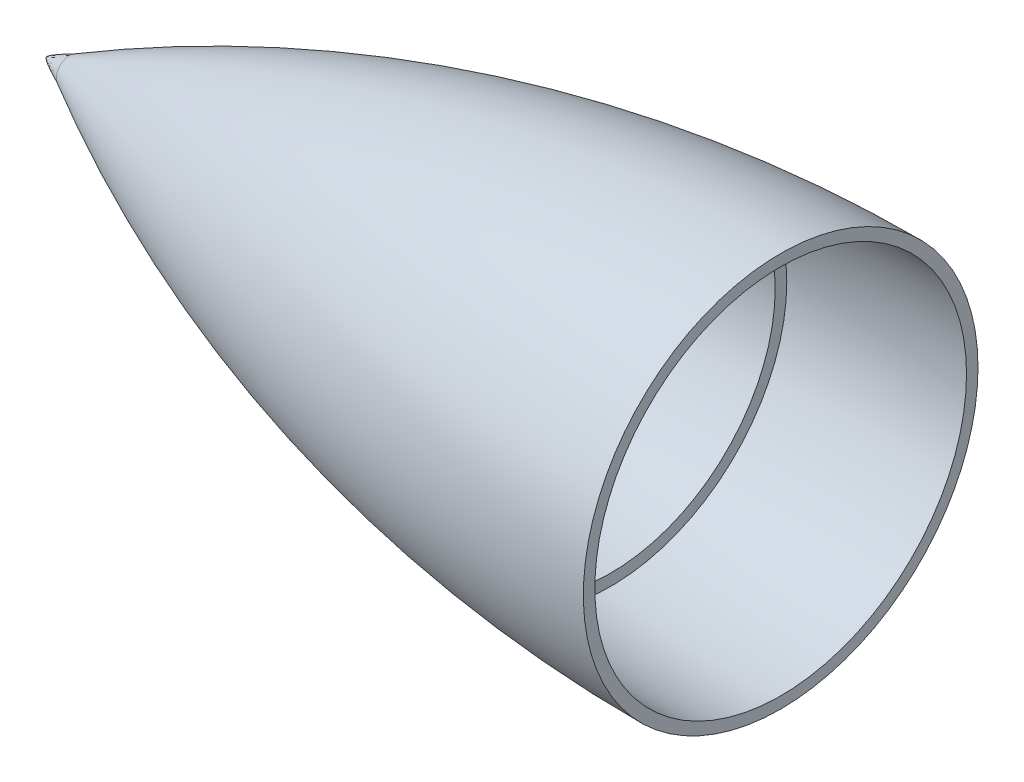
ISO-10303-21;
HEADER;
FILE_DESCRIPTION(('STEP AP214'),'2;1');
FILE_NAME('part.step','',(''),(''),'','','');
FILE_SCHEMA(('AUTOMOTIVE_DESIGN { 1 0 10303 214 1 1 1 1 }'));
ENDSEC;
DATA;
#1=APPLICATION_CONTEXT('core data for automotive mechanical design processes');
#2=APPLICATION_PROTOCOL_DEFINITION('international standard','automotive_design',2000,#1);
#3=PRODUCT_CONTEXT('',#1,'mechanical');
#4=PRODUCT('Part','Part','',(#3));
#5=PRODUCT_RELATED_PRODUCT_CATEGORY('part','',(#4));
#6=PRODUCT_DEFINITION_FORMATION('','',#4);
#7=PRODUCT_DEFINITION_CONTEXT('part definition',#1,'design');
#8=PRODUCT_DEFINITION('design','',#6,#7);
#9=PRODUCT_DEFINITION_SHAPE('','',#8);
#10=(LENGTH_UNIT() NAMED_UNIT(*) SI_UNIT(.MILLI.,.METRE.));
#11=(NAMED_UNIT(*) PLANE_ANGLE_UNIT() SI_UNIT($,.RADIAN.));
#12=(NAMED_UNIT(*) SI_UNIT($,.STERADIAN.) SOLID_ANGLE_UNIT());
#13=UNCERTAINTY_MEASURE_WITH_UNIT(LENGTH_MEASURE(1.E-05),#10,'distance_accuracy_value','');
#14=(GEOMETRIC_REPRESENTATION_CONTEXT(3) GLOBAL_UNCERTAINTY_ASSIGNED_CONTEXT((#13)) GLOBAL_UNIT_ASSIGNED_CONTEXT((#10,
#11,#12)) REPRESENTATION_CONTEXT('',''));
#15=CARTESIAN_POINT('',(0.,0.,0.));
#16=DIRECTION('',(0.,0.,1.));
#17=DIRECTION('',(1.,0.,0.));
#18=AXIS2_PLACEMENT_3D('',#15,#16,#17);
#19=CARTESIAN_POINT('',(0.,276.174418604651,0.));
#20=DIRECTION('',(1.,0.,0.));
#21=DIRECTION('',(0.,0.,-1.));
#22=AXIS2_PLACEMENT_3D('',#19,#20,#21);
#23=DEGENERATE_TOROIDAL_SURFACE('',#22,276.174418604651,319.174418604651,.F.);
#24=CARTESIAN_POINT('',(0.,276.174418604651,0.));
#25=DIRECTION('',(1.,0.,0.));
#26=DIRECTION('',(0.,0.,-1.));
#27=AXIS2_PLACEMENT_3D('',#24,#25,#26);
#28=CIRCLE('',#27,43.);
#29=CARTESIAN_POINT('',(0.,276.174418604651,-43.));
#30=VERTEX_POINT('',#29);
#31=EDGE_CURVE('E47',#30,#30,#28,.T.);
#32=ORIENTED_EDGE('',*,*,#31,.F.);
#33=EDGE_LOOP('',(#32));
#34=FACE_BOUND('',#33,.T.);
#35=CARTESIAN_POINT('',(-155.,276.174418604651,0.));
#36=DIRECTION('',(-1.,0.,0.));
#37=DIRECTION('',(0.,-1.,0.));
#38=AXIS2_PLACEMENT_3D('',#35,#36,#37);
#39=CIRCLE('',#38,2.83688849887309);
#40=CARTESIAN_POINT('',(-155.,273.337530105778,0.));
#41=VERTEX_POINT('',#40);
#42=EDGE_CURVE('E60',#41,#41,#39,.T.);
#43=ORIENTED_EDGE('',*,*,#42,.F.);
#44=EDGE_LOOP('',(#43));
#45=FACE_BOUND('',#44,.T.);
#46=ADVANCED_FACE('F39',(#34,#45),#23,.F.);
#47=CARTESIAN_POINT('',(0.,276.174418604651,0.));
#48=DIRECTION('',(1.,0.,0.));
#49=DIRECTION('',(0.,0.,-1.));
#50=AXIS2_PLACEMENT_3D('',#47,#48,#49);
#51=DEGENERATE_TOROIDAL_SURFACE('',#50,276.174418604651,316.674418604651,.F.);
#52=CARTESIAN_POINT('',(-37.,276.174418604651,0.));
#53=DIRECTION('',(1.,0.,0.));
#54=DIRECTION('',(0.,0.,-1.));
#55=AXIS2_PLACEMENT_3D('',#52,#53,#54);
#56=CIRCLE('',#55,38.3310462104994);
#57=CARTESIAN_POINT('',(-37.,276.174418604651,-38.3310462104994));
#58=VERTEX_POINT('',#57);
#59=EDGE_CURVE('E62',#58,#58,#56,.T.);
#60=ORIENTED_EDGE('',*,*,#59,.F.);
#61=EDGE_LOOP('',(#60));
#62=FACE_BOUND('',#61,.T.);
#63=CARTESIAN_POINT('',(0.,276.174418604651,0.));
#64=DIRECTION('',(1.,0.,0.));
#65=DIRECTION('',(0.,0.,-1.));
#66=AXIS2_PLACEMENT_3D('',#63,#64,#65);
#67=CIRCLE('',#66,40.5000000000001);
#68=CARTESIAN_POINT('',(0.,276.174418604651,-40.5000000000001));
#69=VERTEX_POINT('',#68);
#70=EDGE_CURVE('E11',#69,#69,#67,.T.);
#71=ORIENTED_EDGE('',*,*,#70,.T.);
#72=EDGE_LOOP('',(#71));
#73=FACE_BOUND('',#72,.T.);
#74=ADVANCED_FACE('F41',(#62,#73),#51,.T.);
#75=CARTESIAN_POINT('',(0.,319.174418604651,0.));
#76=DIRECTION('',(-1.,0.,0.));
#77=DIRECTION('',(0.,0.,1.));
#78=AXIS2_PLACEMENT_3D('',#75,#76,#77);
#79=PLANE('',#78);
#80=ORIENTED_EDGE('',*,*,#70,.F.);
#81=EDGE_LOOP('',(#80));
#82=FACE_BOUND('',#81,.T.);
#83=ORIENTED_EDGE('',*,*,#31,.T.);
#84=EDGE_LOOP('',(#83));
#85=FACE_BOUND('',#84,.T.);
#86=ADVANCED_FACE('F76',(#82,#85),#79,.F.);
#87=CARTESIAN_POINT('',(0.,276.174418604651,276.174418604651));
#88=DIRECTION('',(0.,-1.,0.));
#89=DIRECTION('',(0.,0.,-1.));
#90=AXIS2_PLACEMENT_3D('',#87,#88,#89);
#91=CIRCLE('',#90,314.174418604651);
#92=TRIMMED_CURVE('',#91,(PARAMETER_VALUE(-0.496934579399528)),
(PARAMETER_VALUE(0.496934579399528)),.T.,.PARAMETER.);
#93=CARTESIAN_POINT('',(0.,276.174418604651,0.));
#94=DIRECTION('',(1.,0.,0.));
#95=AXIS1_PLACEMENT('',#93,#94);
#96=SURFACE_OF_REVOLUTION('',#92,#95);
#97=CARTESIAN_POINT('',(-149.777354142586,276.174418604651,0.));
#98=VERTEX_POINT('',#97);
#99=VERTEX_LOOP('',#98);
#100=FACE_BOUND('',#99,.T.);
#101=CARTESIAN_POINT('',(-37.,276.174418604651,0.));
#102=DIRECTION('',(1.,0.,0.));
#103=DIRECTION('',(0.,0.,-1.));
#104=AXIS2_PLACEMENT_3D('',#101,#102,#103);
#105=CIRCLE('',#104,35.8136665934388);
#106=CARTESIAN_POINT('',(-37.,276.174418604651,-35.8136665934388));
#107=VERTEX_POINT('',#106);
#108=EDGE_CURVE('E65',#107,#107,#105,.T.);
#109=ORIENTED_EDGE('',*,*,#108,.T.);
#110=EDGE_LOOP('',(#109));
#111=FACE_BOUND('',#110,.T.);
#112=ADVANCED_FACE('F86',(#100,#111),#96,.F.);
#113=CARTESIAN_POINT('',(-37.,311.98808519809,0.));
#114=DIRECTION('',(1.,0.,0.));
#115=DIRECTION('',(0.,0.,-1.));
#116=AXIS2_PLACEMENT_3D('',#113,#114,#115);
#117=PLANE('',#116);
#118=ORIENTED_EDGE('',*,*,#59,.T.);
#119=EDGE_LOOP('',(#118));
#120=FACE_BOUND('',#119,.T.);
#121=ORIENTED_EDGE('',*,*,#108,.F.);
#122=EDGE_LOOP('',(#121));
#123=FACE_BOUND('',#122,.T.);
#124=ADVANCED_FACE('F56',(#120,#123),#117,.T.);
#125=CARTESIAN_POINT('',(-155.,279.011307103524,0.));
#126=CARTESIAN_POINT('',(-160.028237864114,276.689234449932,0.));
#127=CARTESIAN_POINT('',(-160.,276.174418604651,0.));
#128=B_SPLINE_CURVE_WITH_KNOTS('',2,(#125,#126,#127),.UNSPECIFIED.,.F.,.F.,(3,3),(0.,
0.50000000000479),.UNSPECIFIED.);
#129=CARTESIAN_POINT('',(-155.,276.174418604651,0.));
#130=DIRECTION('',(1.,0.,0.));
#131=AXIS1_PLACEMENT('',#129,#130);
#132=SURFACE_OF_REVOLUTION('',#128,#131);
#133=CARTESIAN_POINT('',(-160.,276.174418604651,0.));
#134=VERTEX_POINT('',#133);
#135=VERTEX_LOOP('',#134);
#136=FACE_BOUND('',#135,.T.);
#137=ORIENTED_EDGE('',*,*,#42,.T.);
#138=EDGE_LOOP('',(#137));
#139=FACE_BOUND('',#138,.T.);
#140=ADVANCED_FACE('F53',(#136,#139),#132,.F.);
#141=CLOSED_SHELL('',(#46,#74,#86,#112,#124,#140));
#142=MANIFOLD_SOLID_BREP('B2',#141);
#143=ADVANCED_BREP_SHAPE_REPRESENTATION('',(#18,#142),#14);
#144=SHAPE_DEFINITION_REPRESENTATION(#9,#143);
ENDSEC;
END-ISO-10303-21;
